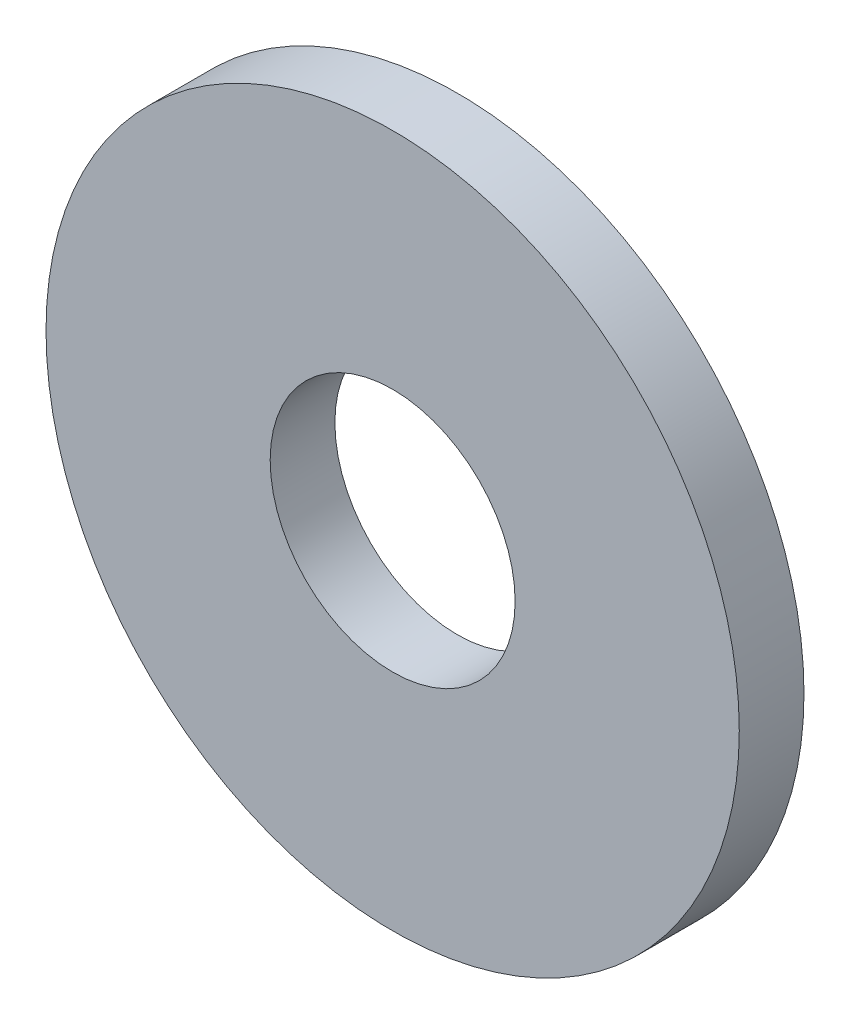
ISO-10303-21;
HEADER;
FILE_DESCRIPTION(('STEP AP214'),'2;1');
FILE_NAME('part.step','',(''),(''),'','','');
FILE_SCHEMA(('AUTOMOTIVE_DESIGN { 1 0 10303 214 1 1 1 1 }'));
ENDSEC;
DATA;
#1=APPLICATION_CONTEXT('core data for automotive mechanical design processes');
#2=APPLICATION_PROTOCOL_DEFINITION('international standard','automotive_design',2000,#1);
#3=PRODUCT_CONTEXT('',#1,'mechanical');
#4=PRODUCT('Part','Part','',(#3));
#5=PRODUCT_RELATED_PRODUCT_CATEGORY('part','',(#4));
#6=PRODUCT_DEFINITION_FORMATION('','',#4);
#7=PRODUCT_DEFINITION_CONTEXT('part definition',#1,'design');
#8=PRODUCT_DEFINITION('design','',#6,#7);
#9=PRODUCT_DEFINITION_SHAPE('','',#8);
#10=(LENGTH_UNIT() NAMED_UNIT(*) SI_UNIT(.MILLI.,.METRE.));
#11=(NAMED_UNIT(*) PLANE_ANGLE_UNIT() SI_UNIT($,.RADIAN.));
#12=(NAMED_UNIT(*) SI_UNIT($,.STERADIAN.) SOLID_ANGLE_UNIT());
#13=UNCERTAINTY_MEASURE_WITH_UNIT(LENGTH_MEASURE(1.E-05),#10,'distance_accuracy_value','');
#14=(GEOMETRIC_REPRESENTATION_CONTEXT(3) GLOBAL_UNCERTAINTY_ASSIGNED_CONTEXT((#13)) GLOBAL_UNIT_ASSIGNED_CONTEXT((#10,
#11,#12)) REPRESENTATION_CONTEXT('',''));
#15=CARTESIAN_POINT('',(0.,0.,0.));
#16=DIRECTION('',(0.,0.,1.));
#17=DIRECTION('',(1.,0.,0.));
#18=AXIS2_PLACEMENT_3D('',#15,#16,#17);
#19=CARTESIAN_POINT('',(0.,0.,1.4));
#20=DIRECTION('',(0.,0.,1.));
#21=DIRECTION('',(1.,0.,0.));
#22=AXIS2_PLACEMENT_3D('',#19,#20,#21);
#23=PLANE('',#22);
#24=CARTESIAN_POINT('',(0.,0.,1.4));
#25=DIRECTION('',(0.,0.,1.));
#26=DIRECTION('',(1.,0.,0.));
#27=AXIS2_PLACEMENT_3D('',#24,#25,#26);
#28=CIRCLE('',#27,7.5);
#29=CARTESIAN_POINT('',(7.5,0.,1.4));
#30=VERTEX_POINT('',#29);
#31=EDGE_CURVE('E10',#30,#30,#28,.T.);
#32=ORIENTED_EDGE('',*,*,#31,.T.);
#33=EDGE_LOOP('',(#32));
#34=FACE_BOUND('',#33,.T.);
#35=CARTESIAN_POINT('',(0.,0.,1.4));
#36=DIRECTION('',(0.,0.,1.));
#37=DIRECTION('',(1.,0.,0.));
#38=AXIS2_PLACEMENT_3D('',#35,#36,#37);
#39=CIRCLE('',#38,2.65);
#40=CARTESIAN_POINT('',(2.65,0.,1.4));
#41=VERTEX_POINT('',#40);
#42=EDGE_CURVE('E43',#41,#41,#39,.T.);
#43=ORIENTED_EDGE('',*,*,#42,.F.);
#44=EDGE_LOOP('',(#43));
#45=FACE_BOUND('',#44,.T.);
#46=ADVANCED_FACE('F32',(#34,#45),#23,.T.);
#47=CARTESIAN_POINT('',(0.,0.,0.));
#48=DIRECTION('',(0.,0.,1.));
#49=DIRECTION('',(1.,0.,0.));
#50=AXIS2_PLACEMENT_3D('',#47,#48,#49);
#51=PLANE('',#50);
#52=CARTESIAN_POINT('',(0.,0.,0.));
#53=DIRECTION('',(0.,0.,1.));
#54=DIRECTION('',(1.,0.,0.));
#55=AXIS2_PLACEMENT_3D('',#52,#53,#54);
#56=CIRCLE('',#55,7.5);
#57=CARTESIAN_POINT('',(7.5,0.,0.));
#58=VERTEX_POINT('',#57);
#59=EDGE_CURVE('E36',#58,#58,#56,.T.);
#60=ORIENTED_EDGE('',*,*,#59,.F.);
#61=EDGE_LOOP('',(#60));
#62=FACE_BOUND('',#61,.T.);
#63=CARTESIAN_POINT('',(0.,0.,0.));
#64=DIRECTION('',(0.,0.,1.));
#65=DIRECTION('',(1.,0.,0.));
#66=AXIS2_PLACEMENT_3D('',#63,#64,#65);
#67=CIRCLE('',#66,2.65);
#68=CARTESIAN_POINT('',(2.65,0.,0.));
#69=VERTEX_POINT('',#68);
#70=EDGE_CURVE('E45',#69,#69,#67,.T.);
#71=ORIENTED_EDGE('',*,*,#70,.T.);
#72=EDGE_LOOP('',(#71));
#73=FACE_BOUND('',#72,.T.);
#74=ADVANCED_FACE('F55',(#62,#73),#51,.F.);
#75=CARTESIAN_POINT('',(0.,0.,1.4));
#76=DIRECTION('',(0.,0.,-1.));
#77=DIRECTION('',(-1.,0.,0.));
#78=AXIS2_PLACEMENT_3D('',#75,#76,#77);
#79=CYLINDRICAL_SURFACE('',#78,7.5);
#80=ORIENTED_EDGE('',*,*,#31,.F.);
#81=EDGE_LOOP('',(#80));
#82=FACE_BOUND('',#81,.T.);
#83=ORIENTED_EDGE('',*,*,#59,.T.);
#84=EDGE_LOOP('',(#83));
#85=FACE_BOUND('',#84,.T.);
#86=ADVANCED_FACE('F34',(#82,#85),#79,.T.);
#87=CARTESIAN_POINT('',(0.,0.,1.4));
#88=DIRECTION('',(0.,0.,-1.));
#89=DIRECTION('',(-1.,0.,0.));
#90=AXIS2_PLACEMENT_3D('',#87,#88,#89);
#91=CYLINDRICAL_SURFACE('',#90,2.65);
#92=ORIENTED_EDGE('',*,*,#42,.T.);
#93=EDGE_LOOP('',(#92));
#94=FACE_BOUND('',#93,.T.);
#95=ORIENTED_EDGE('',*,*,#70,.F.);
#96=EDGE_LOOP('',(#95));
#97=FACE_BOUND('',#96,.T.);
#98=ADVANCED_FACE('F51',(#94,#97),#91,.F.);
#99=CLOSED_SHELL('',(#46,#74,#86,#98));
#100=MANIFOLD_SOLID_BREP('B2',#99);
#101=ADVANCED_BREP_SHAPE_REPRESENTATION('',(#18,#100),#14);
#102=SHAPE_DEFINITION_REPRESENTATION(#9,#101);
ENDSEC;
END-ISO-10303-21;
